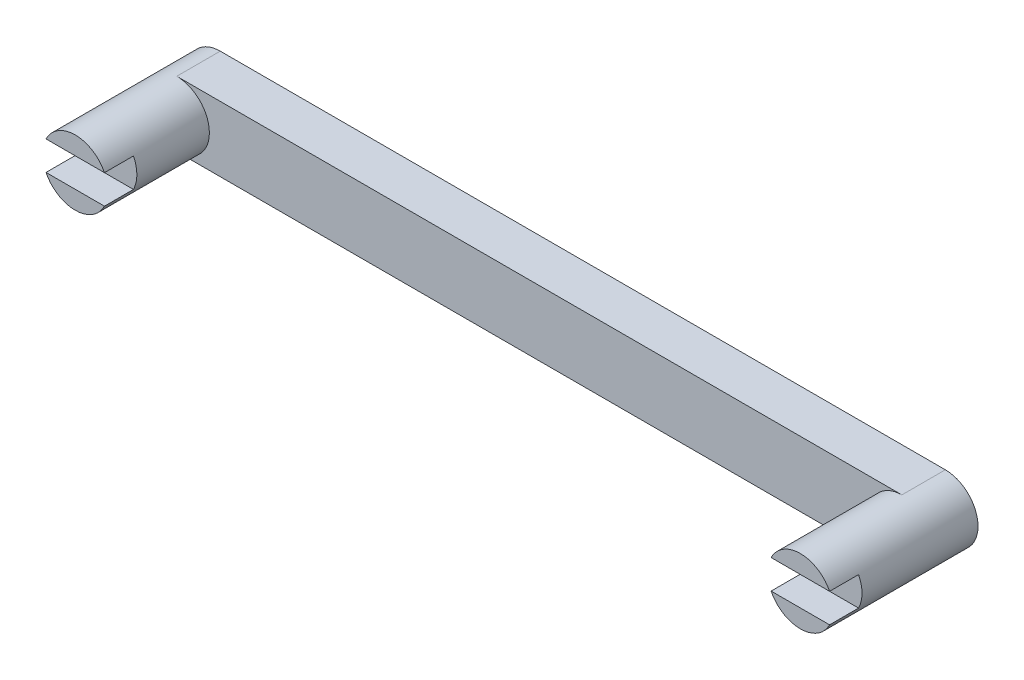
ISO-10303-21;
HEADER;
FILE_DESCRIPTION(('STEP AP214'),'2;1');
FILE_NAME('part.step','',(''),(''),'','','');
FILE_SCHEMA(('AUTOMOTIVE_DESIGN { 1 0 10303 214 1 1 1 1 }'));
ENDSEC;
DATA;
#1=APPLICATION_CONTEXT('core data for automotive mechanical design processes');
#2=APPLICATION_PROTOCOL_DEFINITION('international standard','automotive_design',2000,#1);
#3=PRODUCT_CONTEXT('',#1,'mechanical');
#4=PRODUCT('Part','Part','',(#3));
#5=PRODUCT_RELATED_PRODUCT_CATEGORY('part','',(#4));
#6=PRODUCT_DEFINITION_FORMATION('','',#4);
#7=PRODUCT_DEFINITION_CONTEXT('part definition',#1,'design');
#8=PRODUCT_DEFINITION('design','',#6,#7);
#9=PRODUCT_DEFINITION_SHAPE('','',#8);
#10=(LENGTH_UNIT() NAMED_UNIT(*) SI_UNIT(.MILLI.,.METRE.));
#11=(NAMED_UNIT(*) PLANE_ANGLE_UNIT() SI_UNIT($,.RADIAN.));
#12=(NAMED_UNIT(*) SI_UNIT($,.STERADIAN.) SOLID_ANGLE_UNIT());
#13=UNCERTAINTY_MEASURE_WITH_UNIT(LENGTH_MEASURE(1.E-05),#10,'distance_accuracy_value','');
#14=(GEOMETRIC_REPRESENTATION_CONTEXT(3) GLOBAL_UNCERTAINTY_ASSIGNED_CONTEXT((#13)) GLOBAL_UNIT_ASSIGNED_CONTEXT((#10,
#11,#12)) REPRESENTATION_CONTEXT('',''));
#15=CARTESIAN_POINT('',(0.,0.,0.));
#16=DIRECTION('',(0.,0.,1.));
#17=DIRECTION('',(1.,0.,0.));
#18=AXIS2_PLACEMENT_3D('',#15,#16,#17);
#19=CARTESIAN_POINT('',(0.,0.,10.));
#20=DIRECTION('',(0.,0.,1.));
#21=DIRECTION('',(1.,0.,0.));
#22=AXIS2_PLACEMENT_3D('',#19,#20,#21);
#23=PLANE('',#22);
#24=DIRECTION('',(1.,0.,0.));
#25=VECTOR('',#24,1.);
#26=CARTESIAN_POINT('',(0.,-1.,10.));
#27=LINE('',#26,#25);
#28=CARTESIAN_POINT('',(-2.01556443707464,-1.,10.));
#29=VERTEX_POINT('',#28);
#30=CARTESIAN_POINT('',(2.01556443707464,-1.,10.));
#31=VERTEX_POINT('',#30);
#32=EDGE_CURVE('E193',#29,#31,#27,.T.);
#33=ORIENTED_EDGE('',*,*,#32,.F.);
#34=CARTESIAN_POINT('',(0.,0.,10.));
#35=DIRECTION('',(0.,0.,1.));
#36=DIRECTION('',(1.,0.,0.));
#37=AXIS2_PLACEMENT_3D('',#34,#35,#36);
#38=CIRCLE('',#37,2.25);
#39=EDGE_CURVE('E153',#29,#31,#38,.T.);
#40=ORIENTED_EDGE('',*,*,#39,.T.);
#41=EDGE_LOOP('',(#33,#40));
#42=FACE_BOUND('',#41,.T.);
#43=ADVANCED_FACE('F41',(#42),#23,.T.);
#44=CARTESIAN_POINT('',(0.,0.,10.));
#45=DIRECTION('',(0.,0.,1.));
#46=DIRECTION('',(1.,0.,0.));
#47=AXIS2_PLACEMENT_3D('',#44,#45,#46);
#48=PLANE('',#47);
#49=DIRECTION('',(1.,0.,0.));
#50=VECTOR('',#49,1.);
#51=CARTESIAN_POINT('',(0.,-1.,10.));
#52=LINE('',#51,#50);
#53=CARTESIAN_POINT('',(47.9844355629254,-1.,10.));
#54=VERTEX_POINT('',#53);
#55=CARTESIAN_POINT('',(52.0155644370746,-1.,10.));
#56=VERTEX_POINT('',#55);
#57=EDGE_CURVE('E136',#54,#56,#52,.T.);
#58=ORIENTED_EDGE('',*,*,#57,.F.);
#59=CARTESIAN_POINT('',(50.,0.,10.));
#60=DIRECTION('',(0.,0.,1.));
#61=DIRECTION('',(1.,0.,0.));
#62=AXIS2_PLACEMENT_3D('',#59,#60,#61);
#63=CIRCLE('',#62,2.25);
#64=EDGE_CURVE('E150',#54,#56,#63,.T.);
#65=ORIENTED_EDGE('',*,*,#64,.T.);
#66=EDGE_LOOP('',(#58,#65));
#67=FACE_BOUND('',#66,.T.);
#68=ADVANCED_FACE('F234',(#67),#48,.T.);
#69=CARTESIAN_POINT('',(0.,0.,3.));
#70=DIRECTION('',(0.,0.,1.));
#71=DIRECTION('',(1.,0.,0.));
#72=AXIS2_PLACEMENT_3D('',#69,#70,#71);
#73=PLANE('',#72);
#74=DIRECTION('',(1.,0.,0.));
#75=VECTOR('',#74,1.);
#76=CARTESIAN_POINT('',(0.,-2.25,3.));
#77=LINE('',#76,#75);
#78=CARTESIAN_POINT('',(0.,-2.25,3.));
#79=VERTEX_POINT('',#78);
#80=CARTESIAN_POINT('',(50.,-2.25,3.));
#81=VERTEX_POINT('',#80);
#82=EDGE_CURVE('E166',#79,#81,#77,.T.);
#83=ORIENTED_EDGE('',*,*,#82,.T.);
#84=CARTESIAN_POINT('',(50.,0.,3.));
#85=DIRECTION('',(0.,0.,1.));
#86=DIRECTION('',(1.,0.,0.));
#87=AXIS2_PLACEMENT_3D('',#84,#85,#86);
#88=CIRCLE('',#87,2.25);
#89=CARTESIAN_POINT('',(50.,2.25,3.));
#90=VERTEX_POINT('',#89);
#91=EDGE_CURVE('E149',#81,#90,#88,.F.);
#92=ORIENTED_EDGE('',*,*,#91,.T.);
#93=DIRECTION('',(-1.,0.,0.));
#94=VECTOR('',#93,1.);
#95=CARTESIAN_POINT('',(0.,2.25,3.));
#96=LINE('',#95,#94);
#97=CARTESIAN_POINT('',(0.,2.25,3.));
#98=VERTEX_POINT('',#97);
#99=EDGE_CURVE('E168',#90,#98,#96,.T.);
#100=ORIENTED_EDGE('',*,*,#99,.T.);
#101=CARTESIAN_POINT('',(0.,0.,3.));
#102=DIRECTION('',(0.,0.,1.));
#103=DIRECTION('',(1.,0.,0.));
#104=AXIS2_PLACEMENT_3D('',#101,#102,#103);
#105=CIRCLE('',#104,2.25);
#106=EDGE_CURVE('E163',#98,#79,#105,.F.);
#107=ORIENTED_EDGE('',*,*,#106,.T.);
#108=EDGE_LOOP('',(#83,#92,#100,#107));
#109=FACE_BOUND('',#108,.T.);
#110=ADVANCED_FACE('F240',(#109),#73,.T.);
#111=CARTESIAN_POINT('',(0.,-2.25,3.));
#112=DIRECTION('',(0.,1.,0.));
#113=DIRECTION('',(-1.,0.,0.));
#114=AXIS2_PLACEMENT_3D('',#111,#112,#113);
#115=PLANE('',#114);
#116=DIRECTION('',(1.,0.,0.));
#117=VECTOR('',#116,1.);
#118=CARTESIAN_POINT('',(0.,-2.25,0.));
#119=LINE('',#118,#117);
#120=CARTESIAN_POINT('',(0.,-2.25,0.));
#121=VERTEX_POINT('',#120);
#122=CARTESIAN_POINT('',(50.,-2.25,0.));
#123=VERTEX_POINT('',#122);
#124=EDGE_CURVE('E165',#121,#123,#119,.T.);
#125=ORIENTED_EDGE('',*,*,#124,.T.);
#126=DIRECTION('',(0.,0.,-1.));
#127=VECTOR('',#126,1.);
#128=CARTESIAN_POINT('',(50.,-2.25,3.));
#129=LINE('',#128,#127);
#130=EDGE_CURVE('E137',#81,#123,#129,.T.);
#131=ORIENTED_EDGE('',*,*,#130,.F.);
#132=ORIENTED_EDGE('',*,*,#82,.F.);
#133=DIRECTION('',(0.,0.,-1.));
#134=VECTOR('',#133,1.);
#135=CARTESIAN_POINT('',(0.,-2.25,3.));
#136=LINE('',#135,#134);
#137=EDGE_CURVE('E172',#79,#121,#136,.T.);
#138=ORIENTED_EDGE('',*,*,#137,.T.);
#139=EDGE_LOOP('',(#125,#131,#132,#138));
#140=FACE_BOUND('',#139,.T.);
#141=ADVANCED_FACE('F43',(#140),#115,.F.);
#142=CARTESIAN_POINT('',(50.,0.,3.));
#143=DIRECTION('',(0.,0.,-1.));
#144=DIRECTION('',(-1.,0.,0.));
#145=AXIS2_PLACEMENT_3D('',#142,#143,#144);
#146=CYLINDRICAL_SURFACE('',#145,2.25);
#147=ORIENTED_EDGE('',*,*,#64,.F.);
#148=DIRECTION('',(0.,0.,-1.));
#149=VECTOR('',#148,1.);
#150=CARTESIAN_POINT('',(47.9844355629254,-1.,3.));
#151=LINE('',#150,#149);
#152=CARTESIAN_POINT('',(47.9844355629254,-1.,8.));
#153=VERTEX_POINT('',#152);
#154=EDGE_CURVE('E214',#54,#153,#151,.T.);
#155=ORIENTED_EDGE('',*,*,#154,.T.);
#156=CARTESIAN_POINT('',(50.,0.,8.));
#157=DIRECTION('',(0.,0.,1.));
#158=DIRECTION('',(1.,0.,0.));
#159=AXIS2_PLACEMENT_3D('',#156,#157,#158);
#160=CIRCLE('',#159,2.25);
#161=CARTESIAN_POINT('',(47.9844355629254,1.,8.));
#162=VERTEX_POINT('',#161);
#163=EDGE_CURVE('E11',#162,#153,#160,.T.);
#164=ORIENTED_EDGE('',*,*,#163,.F.);
#165=DIRECTION('',(0.,0.,-1.));
#166=VECTOR('',#165,1.);
#167=CARTESIAN_POINT('',(47.9844355629254,1.,3.));
#168=LINE('',#167,#166);
#169=CARTESIAN_POINT('',(47.9844355629254,1.,10.));
#170=VERTEX_POINT('',#169);
#171=EDGE_CURVE('E131',#162,#170,#168,.F.);
#172=ORIENTED_EDGE('',*,*,#171,.T.);
#173=CARTESIAN_POINT('',(52.0155644370746,1.,10.));
#174=VERTEX_POINT('',#173);
#175=EDGE_CURVE('E144',#174,#170,#63,.T.);
#176=ORIENTED_EDGE('',*,*,#175,.F.);
#177=DIRECTION('',(0.,0.,-1.));
#178=VECTOR('',#177,1.);
#179=CARTESIAN_POINT('',(52.0155644370746,1.,3.));
#180=LINE('',#179,#178);
#181=CARTESIAN_POINT('',(52.0155644370746,1.,8.));
#182=VERTEX_POINT('',#181);
#183=EDGE_CURVE('E64',#174,#182,#180,.T.);
#184=ORIENTED_EDGE('',*,*,#183,.T.);
#185=CARTESIAN_POINT('',(52.0155644370746,-1.,8.));
#186=VERTEX_POINT('',#185);
#187=EDGE_CURVE('E45',#186,#182,#160,.T.);
#188=ORIENTED_EDGE('',*,*,#187,.F.);
#189=DIRECTION('',(0.,0.,-1.));
#190=VECTOR('',#189,1.);
#191=CARTESIAN_POINT('',(52.0155644370746,-1.,3.));
#192=LINE('',#191,#190);
#193=EDGE_CURVE('E212',#186,#56,#192,.F.);
#194=ORIENTED_EDGE('',*,*,#193,.T.);
#195=EDGE_LOOP('',(#147,#155,#164,#172,#176,#184,#188,#194));
#196=FACE_BOUND('',#195,.T.);
#197=CARTESIAN_POINT('',(50.,0.,0.));
#198=DIRECTION('',(0.,0.,1.));
#199=DIRECTION('',(1.,0.,0.));
#200=AXIS2_PLACEMENT_3D('',#197,#198,#199);
#201=CIRCLE('',#200,2.25);
#202=CARTESIAN_POINT('',(50.,2.25,0.));
#203=VERTEX_POINT('',#202);
#204=EDGE_CURVE('E175',#123,#203,#201,.T.);
#205=ORIENTED_EDGE('',*,*,#204,.T.);
#206=DIRECTION('',(0.,0.,-1.));
#207=VECTOR('',#206,1.);
#208=CARTESIAN_POINT('',(50.,2.25,3.));
#209=LINE('',#208,#207);
#210=EDGE_CURVE('E185',#90,#203,#209,.T.);
#211=ORIENTED_EDGE('',*,*,#210,.F.);
#212=ORIENTED_EDGE('',*,*,#91,.F.);
#213=ORIENTED_EDGE('',*,*,#130,.T.);
#214=EDGE_LOOP('',(#205,#211,#212,#213));
#215=FACE_BOUND('',#214,.T.);
#216=ADVANCED_FACE('F142',(#196,#215),#146,.T.);
#217=CARTESIAN_POINT('',(0.,2.25,3.));
#218=DIRECTION('',(0.,-1.,0.));
#219=DIRECTION('',(1.,0.,0.));
#220=AXIS2_PLACEMENT_3D('',#217,#218,#219);
#221=PLANE('',#220);
#222=DIRECTION('',(-1.,0.,0.));
#223=VECTOR('',#222,1.);
#224=CARTESIAN_POINT('',(0.,2.25,0.));
#225=LINE('',#224,#223);
#226=CARTESIAN_POINT('',(0.,2.25,0.));
#227=VERTEX_POINT('',#226);
#228=EDGE_CURVE('E177',#203,#227,#225,.T.);
#229=ORIENTED_EDGE('',*,*,#228,.T.);
#230=DIRECTION('',(0.,0.,-1.));
#231=VECTOR('',#230,1.);
#232=CARTESIAN_POINT('',(0.,2.25,3.));
#233=LINE('',#232,#231);
#234=EDGE_CURVE('E182',#98,#227,#233,.T.);
#235=ORIENTED_EDGE('',*,*,#234,.F.);
#236=ORIENTED_EDGE('',*,*,#99,.F.);
#237=ORIENTED_EDGE('',*,*,#210,.T.);
#238=EDGE_LOOP('',(#229,#235,#236,#237));
#239=FACE_BOUND('',#238,.T.);
#240=ADVANCED_FACE('F369',(#239),#221,.F.);
#241=CARTESIAN_POINT('',(0.,0.,3.));
#242=DIRECTION('',(0.,0.,-1.));
#243=DIRECTION('',(-1.,0.,0.));
#244=AXIS2_PLACEMENT_3D('',#241,#242,#243);
#245=CYLINDRICAL_SURFACE('',#244,2.25);
#246=ORIENTED_EDGE('',*,*,#39,.F.);
#247=DIRECTION('',(0.,0.,-1.));
#248=VECTOR('',#247,1.);
#249=CARTESIAN_POINT('',(-2.01556443707464,-1.,3.));
#250=LINE('',#249,#248);
#251=CARTESIAN_POINT('',(-2.01556443707464,-1.,8.));
#252=VERTEX_POINT('',#251);
#253=EDGE_CURVE('E156',#29,#252,#250,.T.);
#254=ORIENTED_EDGE('',*,*,#253,.T.);
#255=CARTESIAN_POINT('',(0.,0.,8.));
#256=DIRECTION('',(0.,0.,1.));
#257=DIRECTION('',(1.,0.,0.));
#258=AXIS2_PLACEMENT_3D('',#255,#256,#257);
#259=CIRCLE('',#258,2.25);
#260=CARTESIAN_POINT('',(-2.01556443707464,1.,8.));
#261=VERTEX_POINT('',#260);
#262=EDGE_CURVE('E195',#261,#252,#259,.T.);
#263=ORIENTED_EDGE('',*,*,#262,.F.);
#264=DIRECTION('',(0.,0.,-1.));
#265=VECTOR('',#264,1.);
#266=CARTESIAN_POINT('',(-2.01556443707464,1.,3.));
#267=LINE('',#266,#265);
#268=CARTESIAN_POINT('',(-2.01556443707464,1.,10.));
#269=VERTEX_POINT('',#268);
#270=EDGE_CURVE('E218',#261,#269,#267,.F.);
#271=ORIENTED_EDGE('',*,*,#270,.T.);
#272=CARTESIAN_POINT('',(2.01556443707464,1.,10.));
#273=VERTEX_POINT('',#272);
#274=EDGE_CURVE('E160',#273,#269,#38,.T.);
#275=ORIENTED_EDGE('',*,*,#274,.F.);
#276=DIRECTION('',(0.,0.,-1.));
#277=VECTOR('',#276,1.);
#278=CARTESIAN_POINT('',(2.01556443707464,1.,3.));
#279=LINE('',#278,#277);
#280=CARTESIAN_POINT('',(2.01556443707464,1.,8.));
#281=VERTEX_POINT('',#280);
#282=EDGE_CURVE('E56',#273,#281,#279,.T.);
#283=ORIENTED_EDGE('',*,*,#282,.T.);
#284=CARTESIAN_POINT('',(2.01556443707464,-1.,8.));
#285=VERTEX_POINT('',#284);
#286=EDGE_CURVE('E194',#285,#281,#259,.T.);
#287=ORIENTED_EDGE('',*,*,#286,.F.);
#288=DIRECTION('',(0.,0.,-1.));
#289=VECTOR('',#288,1.);
#290=CARTESIAN_POINT('',(2.01556443707464,-1.,3.));
#291=LINE('',#290,#289);
#292=EDGE_CURVE('E221',#285,#31,#291,.F.);
#293=ORIENTED_EDGE('',*,*,#292,.T.);
#294=EDGE_LOOP('',(#246,#254,#263,#271,#275,#283,#287,#293));
#295=FACE_BOUND('',#294,.T.);
#296=CARTESIAN_POINT('',(0.,0.,0.));
#297=DIRECTION('',(0.,0.,1.));
#298=DIRECTION('',(1.,0.,0.));
#299=AXIS2_PLACEMENT_3D('',#296,#297,#298);
#300=CIRCLE('',#299,2.25);
#301=EDGE_CURVE('E169',#227,#121,#300,.T.);
#302=ORIENTED_EDGE('',*,*,#301,.T.);
#303=ORIENTED_EDGE('',*,*,#137,.F.);
#304=ORIENTED_EDGE('',*,*,#106,.F.);
#305=ORIENTED_EDGE('',*,*,#234,.T.);
#306=EDGE_LOOP('',(#302,#303,#304,#305));
#307=FACE_BOUND('',#306,.T.);
#308=ADVANCED_FACE('F227',(#295,#307),#245,.T.);
#309=CARTESIAN_POINT('',(0.,0.,0.));
#310=DIRECTION('',(0.,0.,1.));
#311=DIRECTION('',(1.,0.,0.));
#312=AXIS2_PLACEMENT_3D('',#309,#310,#311);
#313=PLANE('',#312);
#314=ORIENTED_EDGE('',*,*,#204,.F.);
#315=ORIENTED_EDGE('',*,*,#124,.F.);
#316=ORIENTED_EDGE('',*,*,#301,.F.);
#317=ORIENTED_EDGE('',*,*,#228,.F.);
#318=EDGE_LOOP('',(#314,#315,#316,#317));
#319=FACE_BOUND('',#318,.T.);
#320=ADVANCED_FACE('F245',(#319),#313,.F.);
#321=DIRECTION('',(-1.,0.,0.));
#322=VECTOR('',#321,1.);
#323=CARTESIAN_POINT('',(0.,1.,10.));
#324=LINE('',#323,#322);
#325=EDGE_CURVE('E191',#273,#269,#324,.T.);
#326=ORIENTED_EDGE('',*,*,#325,.F.);
#327=ORIENTED_EDGE('',*,*,#274,.T.);
#328=EDGE_LOOP('',(#326,#327));
#329=FACE_BOUND('',#328,.T.);
#330=ADVANCED_FACE('F236',(#329),#23,.T.);
#331=DIRECTION('',(-1.,0.,0.));
#332=VECTOR('',#331,1.);
#333=CARTESIAN_POINT('',(0.,1.,10.));
#334=LINE('',#333,#332);
#335=EDGE_CURVE('E128',#174,#170,#334,.T.);
#336=ORIENTED_EDGE('',*,*,#335,.F.);
#337=ORIENTED_EDGE('',*,*,#175,.T.);
#338=EDGE_LOOP('',(#336,#337));
#339=FACE_BOUND('',#338,.T.);
#340=ADVANCED_FACE('F148',(#339),#48,.T.);
#341=CARTESIAN_POINT('',(0.,0.,8.));
#342=DIRECTION('',(0.,0.,1.));
#343=DIRECTION('',(1.,0.,0.));
#344=AXIS2_PLACEMENT_3D('',#341,#342,#343);
#345=PLANE('',#344);
#346=ORIENTED_EDGE('',*,*,#163,.T.);
#347=DIRECTION('',(1.,0.,0.));
#348=VECTOR('',#347,1.);
#349=CARTESIAN_POINT('',(47.5,-1.,8.));
#350=LINE('',#349,#348);
#351=EDGE_CURVE('E208',#153,#186,#350,.T.);
#352=ORIENTED_EDGE('',*,*,#351,.T.);
#353=ORIENTED_EDGE('',*,*,#187,.T.);
#354=DIRECTION('',(-1.,0.,0.));
#355=VECTOR('',#354,1.);
#356=CARTESIAN_POINT('',(47.5,1.,8.));
#357=LINE('',#356,#355);
#358=EDGE_CURVE('E206',#182,#162,#357,.T.);
#359=ORIENTED_EDGE('',*,*,#358,.T.);
#360=EDGE_LOOP('',(#346,#352,#353,#359));
#361=FACE_BOUND('',#360,.T.);
#362=ADVANCED_FACE('F205',(#361),#345,.T.);
#363=CARTESIAN_POINT('',(47.5,-1.,8.));
#364=DIRECTION('',(0.,-1.,0.));
#365=DIRECTION('',(0.,0.,-1.));
#366=AXIS2_PLACEMENT_3D('',#363,#364,#365);
#367=PLANE('',#366);
#368=ORIENTED_EDGE('',*,*,#57,.T.);
#369=ORIENTED_EDGE('',*,*,#193,.F.);
#370=ORIENTED_EDGE('',*,*,#351,.F.);
#371=ORIENTED_EDGE('',*,*,#154,.F.);
#372=EDGE_LOOP('',(#368,#369,#370,#371));
#373=FACE_BOUND('',#372,.T.);
#374=ADVANCED_FACE('F266',(#373),#367,.F.);
#375=CARTESIAN_POINT('',(47.5,1.,8.));
#376=DIRECTION('',(0.,1.,0.));
#377=DIRECTION('',(0.,0.,1.));
#378=AXIS2_PLACEMENT_3D('',#375,#376,#377);
#379=PLANE('',#378);
#380=ORIENTED_EDGE('',*,*,#335,.T.);
#381=ORIENTED_EDGE('',*,*,#171,.F.);
#382=ORIENTED_EDGE('',*,*,#358,.F.);
#383=ORIENTED_EDGE('',*,*,#183,.F.);
#384=EDGE_LOOP('',(#380,#381,#382,#383));
#385=FACE_BOUND('',#384,.T.);
#386=ADVANCED_FACE('F130',(#385),#379,.F.);
#387=CARTESIAN_POINT('',(0.,0.,8.));
#388=DIRECTION('',(0.,0.,1.));
#389=DIRECTION('',(1.,0.,0.));
#390=AXIS2_PLACEMENT_3D('',#387,#388,#389);
#391=PLANE('',#390);
#392=ORIENTED_EDGE('',*,*,#262,.T.);
#393=DIRECTION('',(1.,0.,0.));
#394=VECTOR('',#393,1.);
#395=CARTESIAN_POINT('',(-2.5,-1.,8.));
#396=LINE('',#395,#394);
#397=EDGE_CURVE('E146',#252,#285,#396,.T.);
#398=ORIENTED_EDGE('',*,*,#397,.T.);
#399=ORIENTED_EDGE('',*,*,#286,.T.);
#400=DIRECTION('',(-1.,0.,0.));
#401=VECTOR('',#400,1.);
#402=CARTESIAN_POINT('',(-2.5,1.,8.));
#403=LINE('',#402,#401);
#404=EDGE_CURVE('E210',#281,#261,#403,.T.);
#405=ORIENTED_EDGE('',*,*,#404,.T.);
#406=EDGE_LOOP('',(#392,#398,#399,#405));
#407=FACE_BOUND('',#406,.T.);
#408=ADVANCED_FACE('F255',(#407),#391,.T.);
#409=CARTESIAN_POINT('',(-2.5,-1.,8.));
#410=DIRECTION('',(0.,-1.,0.));
#411=DIRECTION('',(0.,0.,-1.));
#412=AXIS2_PLACEMENT_3D('',#409,#410,#411);
#413=PLANE('',#412);
#414=ORIENTED_EDGE('',*,*,#32,.T.);
#415=ORIENTED_EDGE('',*,*,#292,.F.);
#416=ORIENTED_EDGE('',*,*,#397,.F.);
#417=ORIENTED_EDGE('',*,*,#253,.F.);
#418=EDGE_LOOP('',(#414,#415,#416,#417));
#419=FACE_BOUND('',#418,.T.);
#420=ADVANCED_FACE('F231',(#419),#413,.F.);
#421=CARTESIAN_POINT('',(-2.5,1.,8.));
#422=DIRECTION('',(0.,1.,0.));
#423=DIRECTION('',(0.,0.,1.));
#424=AXIS2_PLACEMENT_3D('',#421,#422,#423);
#425=PLANE('',#424);
#426=ORIENTED_EDGE('',*,*,#325,.T.);
#427=ORIENTED_EDGE('',*,*,#270,.F.);
#428=ORIENTED_EDGE('',*,*,#404,.F.);
#429=ORIENTED_EDGE('',*,*,#282,.F.);
#430=EDGE_LOOP('',(#426,#427,#428,#429));
#431=FACE_BOUND('',#430,.T.);
#432=ADVANCED_FACE('F254',(#431),#425,.F.);
#433=CLOSED_SHELL('',(#43,#68,#110,#141,#216,#240,#308,#320,#330,#340,#362,#374,#386,#408,#420,#432));
#434=MANIFOLD_SOLID_BREP('B2',#433);
#435=ADVANCED_BREP_SHAPE_REPRESENTATION('',(#18,#434),#14);
#436=SHAPE_DEFINITION_REPRESENTATION(#9,#435);
ENDSEC;
END-ISO-10303-21;
